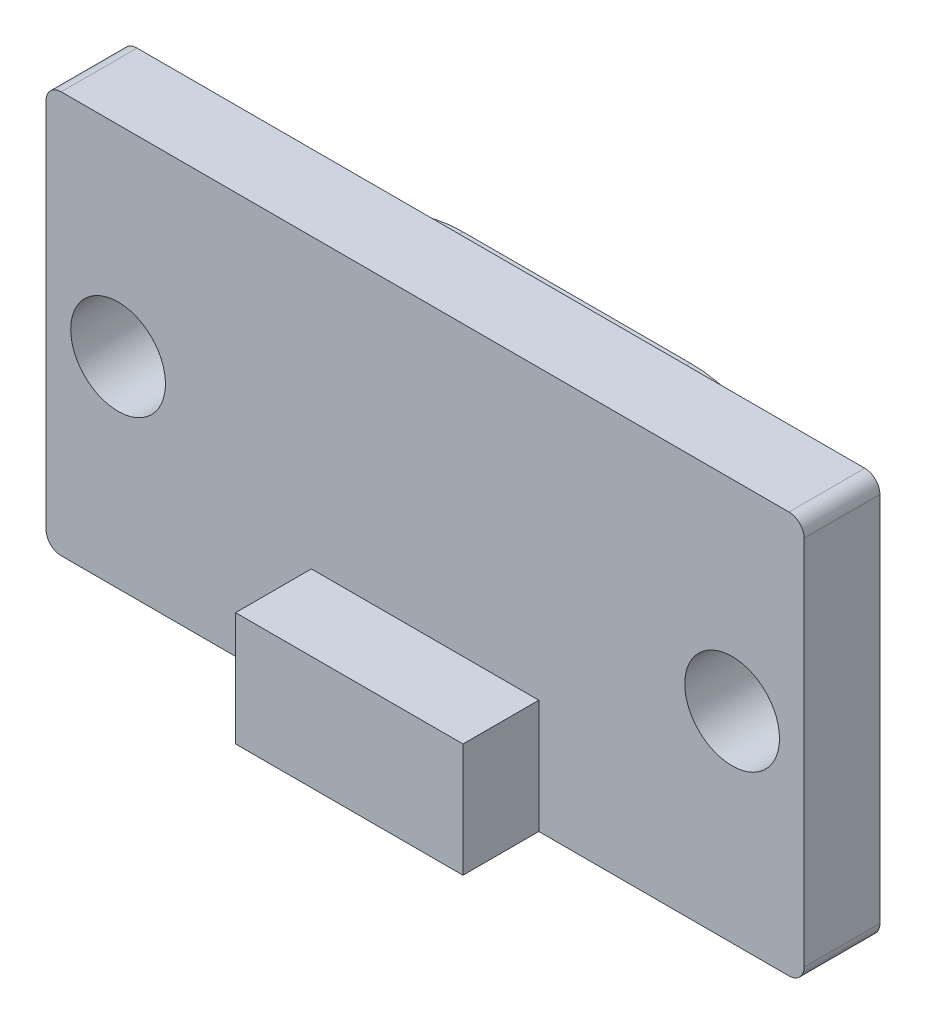
ISO-10303-21;
HEADER;
FILE_DESCRIPTION(('STEP AP214'),'2;1');
FILE_NAME('part.step','',(''),(''),'','','');
FILE_SCHEMA(('AUTOMOTIVE_DESIGN { 1 0 10303 214 1 1 1 1 }'));
ENDSEC;
DATA;
#1=APPLICATION_CONTEXT('core data for automotive mechanical design processes');
#2=APPLICATION_PROTOCOL_DEFINITION('international standard','automotive_design',2000,#1);
#3=PRODUCT_CONTEXT('',#1,'mechanical');
#4=PRODUCT('Part','Part','',(#3));
#5=PRODUCT_RELATED_PRODUCT_CATEGORY('part','',(#4));
#6=PRODUCT_DEFINITION_FORMATION('','',#4);
#7=PRODUCT_DEFINITION_CONTEXT('part definition',#1,'design');
#8=PRODUCT_DEFINITION('design','',#6,#7);
#9=PRODUCT_DEFINITION_SHAPE('','',#8);
#10=(LENGTH_UNIT() NAMED_UNIT(*) SI_UNIT(.MILLI.,.METRE.));
#11=(NAMED_UNIT(*) PLANE_ANGLE_UNIT() SI_UNIT($,.RADIAN.));
#12=(NAMED_UNIT(*) SI_UNIT($,.STERADIAN.) SOLID_ANGLE_UNIT());
#13=UNCERTAINTY_MEASURE_WITH_UNIT(LENGTH_MEASURE(1.E-05),#10,'distance_accuracy_value','');
#14=(GEOMETRIC_REPRESENTATION_CONTEXT(3) GLOBAL_UNCERTAINTY_ASSIGNED_CONTEXT((#13)) GLOBAL_UNIT_ASSIGNED_CONTEXT((#10,
#11,#12)) REPRESENTATION_CONTEXT('',''));
#15=CARTESIAN_POINT('',(0.,0.,0.));
#16=DIRECTION('',(0.,0.,1.));
#17=DIRECTION('',(1.,0.,0.));
#18=AXIS2_PLACEMENT_3D('',#15,#16,#17);
#19=CARTESIAN_POINT('',(0.,0.,2.));
#20=DIRECTION('',(0.,0.,-1.));
#21=DIRECTION('',(-1.,0.,0.));
#22=AXIS2_PLACEMENT_3D('',#19,#20,#21);
#23=PLANE('',#22);
#24=CARTESIAN_POINT('',(-8.1,0.,2.));
#25=DIRECTION('',(0.,0.,1.));
#26=DIRECTION('',(-1.,0.,0.));
#27=AXIS2_PLACEMENT_3D('',#24,#25,#26);
#28=CIRCLE('',#27,1.25);
#29=CARTESIAN_POINT('',(-9.35,0.,2.));
#30=VERTEX_POINT('',#29);
#31=EDGE_CURVE('E212',#30,#30,#28,.T.);
#32=ORIENTED_EDGE('',*,*,#31,.F.);
#33=EDGE_LOOP('',(#32));
#34=FACE_BOUND('',#33,.T.);
#35=CARTESIAN_POINT('',(8.1,0.,2.));
#36=DIRECTION('',(0.,0.,1.));
#37=DIRECTION('',(1.,0.,0.));
#38=AXIS2_PLACEMENT_3D('',#35,#36,#37);
#39=CIRCLE('',#38,1.25);
#40=CARTESIAN_POINT('',(9.35,0.,2.));
#41=VERTEX_POINT('',#40);
#42=EDGE_CURVE('E218',#41,#41,#39,.T.);
#43=ORIENTED_EDGE('',*,*,#42,.F.);
#44=EDGE_LOOP('',(#43));
#45=FACE_BOUND('',#44,.T.);
#46=DIRECTION('',(1.,0.,0.));
#47=VECTOR('',#46,1.);
#48=CARTESIAN_POINT('',(-10.,-5.3,2.));
#49=LINE('',#48,#47);
#50=CARTESIAN_POINT('',(3.,-5.3,2.));
#51=VERTEX_POINT('',#50);
#52=CARTESIAN_POINT('',(9.6,-5.3,2.));
#53=VERTEX_POINT('',#52);
#54=EDGE_CURVE('E232',#51,#53,#49,.T.);
#55=ORIENTED_EDGE('',*,*,#54,.T.);
#56=CARTESIAN_POINT('',(9.6,-4.9,2.));
#57=DIRECTION('',(0.,0.,-1.));
#58=DIRECTION('',(-1.,0.,0.));
#59=AXIS2_PLACEMENT_3D('',#56,#57,#58);
#60=CIRCLE('',#59,0.4);
#61=CARTESIAN_POINT('',(10.,-4.9,2.));
#62=VERTEX_POINT('',#61);
#63=EDGE_CURVE('E267',#53,#62,#60,.F.);
#64=ORIENTED_EDGE('',*,*,#63,.T.);
#65=DIRECTION('',(0.,1.,0.));
#66=VECTOR('',#65,1.);
#67=CARTESIAN_POINT('',(10.,-5.3,2.));
#68=LINE('',#67,#66);
#69=CARTESIAN_POINT('',(10.,4.9,2.));
#70=VERTEX_POINT('',#69);
#71=EDGE_CURVE('E224',#62,#70,#68,.T.);
#72=ORIENTED_EDGE('',*,*,#71,.T.);
#73=CARTESIAN_POINT('',(9.6,4.9,2.));
#74=DIRECTION('',(0.,0.,-1.));
#75=DIRECTION('',(-1.,0.,0.));
#76=AXIS2_PLACEMENT_3D('',#73,#74,#75);
#77=CIRCLE('',#76,0.4);
#78=CARTESIAN_POINT('',(9.6,5.3,2.));
#79=VERTEX_POINT('',#78);
#80=EDGE_CURVE('E262',#70,#79,#77,.F.);
#81=ORIENTED_EDGE('',*,*,#80,.T.);
#82=DIRECTION('',(-1.,0.,0.));
#83=VECTOR('',#82,1.);
#84=CARTESIAN_POINT('',(-10.,5.3,2.));
#85=LINE('',#84,#83);
#86=CARTESIAN_POINT('',(-9.6,5.3,2.));
#87=VERTEX_POINT('',#86);
#88=EDGE_CURVE('E227',#79,#87,#85,.T.);
#89=ORIENTED_EDGE('',*,*,#88,.T.);
#90=CARTESIAN_POINT('',(-9.6,4.9,2.));
#91=DIRECTION('',(0.,0.,-1.));
#92=DIRECTION('',(-1.,0.,0.));
#93=AXIS2_PLACEMENT_3D('',#90,#91,#92);
#94=CIRCLE('',#93,0.4);
#95=CARTESIAN_POINT('',(-10.,4.9,2.));
#96=VERTEX_POINT('',#95);
#97=EDGE_CURVE('E60',#87,#96,#94,.F.);
#98=ORIENTED_EDGE('',*,*,#97,.T.);
#99=DIRECTION('',(0.,-1.,0.));
#100=VECTOR('',#99,1.);
#101=CARTESIAN_POINT('',(-10.,-5.3,2.));
#102=LINE('',#101,#100);
#103=CARTESIAN_POINT('',(-10.,-4.9,2.));
#104=VERTEX_POINT('',#103);
#105=EDGE_CURVE('E230',#96,#104,#102,.T.);
#106=ORIENTED_EDGE('',*,*,#105,.T.);
#107=CARTESIAN_POINT('',(-9.6,-4.9,2.));
#108=DIRECTION('',(0.,0.,-1.));
#109=DIRECTION('',(-1.,0.,0.));
#110=AXIS2_PLACEMENT_3D('',#107,#108,#109);
#111=CIRCLE('',#110,0.4);
#112=CARTESIAN_POINT('',(-9.6,-5.3,2.));
#113=VERTEX_POINT('',#112);
#114=EDGE_CURVE('E265',#104,#113,#111,.F.);
#115=ORIENTED_EDGE('',*,*,#114,.T.);
#116=CARTESIAN_POINT('',(-3.,-5.3,2.));
#117=VERTEX_POINT('',#116);
#118=EDGE_CURVE('E233',#113,#117,#49,.T.);
#119=ORIENTED_EDGE('',*,*,#118,.T.);
#120=DIRECTION('',(0.,-1.,0.));
#121=VECTOR('',#120,1.);
#122=CARTESIAN_POINT('',(-3.,-2.3,2.));
#123=LINE('',#122,#121);
#124=CARTESIAN_POINT('',(-3.,-2.3,2.));
#125=VERTEX_POINT('',#124);
#126=EDGE_CURVE('E173',#125,#117,#123,.T.);
#127=ORIENTED_EDGE('',*,*,#126,.F.);
#128=DIRECTION('',(-1.,0.,0.));
#129=VECTOR('',#128,1.);
#130=CARTESIAN_POINT('',(-3.,-2.3,2.));
#131=LINE('',#130,#129);
#132=CARTESIAN_POINT('',(3.,-2.3,2.));
#133=VERTEX_POINT('',#132);
#134=EDGE_CURVE('E517',#133,#125,#131,.T.);
#135=ORIENTED_EDGE('',*,*,#134,.F.);
#136=DIRECTION('',(0.,1.,0.));
#137=VECTOR('',#136,1.);
#138=CARTESIAN_POINT('',(3.,-2.3,2.));
#139=LINE('',#138,#137);
#140=EDGE_CURVE('E176',#51,#133,#139,.T.);
#141=ORIENTED_EDGE('',*,*,#140,.F.);
#142=EDGE_LOOP('',(#55,#64,#72,#81,#89,#98,#106,#115,#119,#127,#135,#141));
#143=FACE_BOUND('',#142,.T.);
#144=ADVANCED_FACE('F38',(#34,#45,#143),#23,.F.);
#145=CARTESIAN_POINT('',(0.,0.,0.));
#146=DIRECTION('',(0.,0.,-1.));
#147=DIRECTION('',(-1.,0.,0.));
#148=AXIS2_PLACEMENT_3D('',#145,#146,#147);
#149=PLANE('',#148);
#150=CARTESIAN_POINT('',(8.1,0.,0.));
#151=DIRECTION('',(0.,0.,1.));
#152=DIRECTION('',(1.,0.,0.));
#153=AXIS2_PLACEMENT_3D('',#150,#151,#152);
#154=CIRCLE('',#153,1.25);
#155=CARTESIAN_POINT('',(9.35,0.,0.));
#156=VERTEX_POINT('',#155);
#157=EDGE_CURVE('E215',#156,#156,#154,.T.);
#158=ORIENTED_EDGE('',*,*,#157,.T.);
#159=EDGE_LOOP('',(#158));
#160=FACE_BOUND('',#159,.T.);
#161=DIRECTION('',(0.,1.,0.));
#162=VECTOR('',#161,1.);
#163=CARTESIAN_POINT('',(10.,-5.3,0.));
#164=LINE('',#163,#162);
#165=CARTESIAN_POINT('',(10.,-4.9,0.));
#166=VERTEX_POINT('',#165);
#167=CARTESIAN_POINT('',(10.,4.9,0.));
#168=VERTEX_POINT('',#167);
#169=EDGE_CURVE('E221',#166,#168,#164,.T.);
#170=ORIENTED_EDGE('',*,*,#169,.F.);
#171=CARTESIAN_POINT('',(9.6,-4.9,0.));
#172=DIRECTION('',(0.,0.,-1.));
#173=DIRECTION('',(-1.,0.,0.));
#174=AXIS2_PLACEMENT_3D('',#171,#172,#173);
#175=CIRCLE('',#174,0.4);
#176=CARTESIAN_POINT('',(9.6,-5.3,0.));
#177=VERTEX_POINT('',#176);
#178=EDGE_CURVE('E255',#166,#177,#175,.T.);
#179=ORIENTED_EDGE('',*,*,#178,.T.);
#180=DIRECTION('',(1.,0.,0.));
#181=VECTOR('',#180,1.);
#182=CARTESIAN_POINT('',(-10.,-5.3,0.));
#183=LINE('',#182,#181);
#184=CARTESIAN_POINT('',(-9.6,-5.3,0.));
#185=VERTEX_POINT('',#184);
#186=EDGE_CURVE('E228',#185,#177,#183,.T.);
#187=ORIENTED_EDGE('',*,*,#186,.F.);
#188=CARTESIAN_POINT('',(-9.6,-4.9,0.));
#189=DIRECTION('',(0.,0.,-1.));
#190=DIRECTION('',(-1.,0.,0.));
#191=AXIS2_PLACEMENT_3D('',#188,#189,#190);
#192=CIRCLE('',#191,0.4);
#193=CARTESIAN_POINT('',(-10.,-4.9,0.));
#194=VERTEX_POINT('',#193);
#195=EDGE_CURVE('E253',#185,#194,#192,.T.);
#196=ORIENTED_EDGE('',*,*,#195,.T.);
#197=DIRECTION('',(0.,-1.,0.));
#198=VECTOR('',#197,1.);
#199=CARTESIAN_POINT('',(-10.,-5.3,0.));
#200=LINE('',#199,#198);
#201=CARTESIAN_POINT('',(-10.,4.9,0.));
#202=VERTEX_POINT('',#201);
#203=EDGE_CURVE('E241',#202,#194,#200,.T.);
#204=ORIENTED_EDGE('',*,*,#203,.F.);
#205=CARTESIAN_POINT('',(-9.6,4.9,0.));
#206=DIRECTION('',(0.,0.,-1.));
#207=DIRECTION('',(-1.,0.,0.));
#208=AXIS2_PLACEMENT_3D('',#205,#206,#207);
#209=CIRCLE('',#208,0.4);
#210=CARTESIAN_POINT('',(-9.6,5.3,0.));
#211=VERTEX_POINT('',#210);
#212=EDGE_CURVE('E251',#202,#211,#209,.T.);
#213=ORIENTED_EDGE('',*,*,#212,.T.);
#214=DIRECTION('',(-1.,0.,0.));
#215=VECTOR('',#214,1.);
#216=CARTESIAN_POINT('',(-10.,5.3,0.));
#217=LINE('',#216,#215);
#218=CARTESIAN_POINT('',(9.6,5.3,0.));
#219=VERTEX_POINT('',#218);
#220=EDGE_CURVE('E238',#219,#211,#217,.T.);
#221=ORIENTED_EDGE('',*,*,#220,.F.);
#222=CARTESIAN_POINT('',(9.6,4.9,0.));
#223=DIRECTION('',(0.,0.,-1.));
#224=DIRECTION('',(-1.,0.,0.));
#225=AXIS2_PLACEMENT_3D('',#222,#223,#224);
#226=CIRCLE('',#225,0.4);
#227=EDGE_CURVE('E249',#219,#168,#226,.T.);
#228=ORIENTED_EDGE('',*,*,#227,.T.);
#229=EDGE_LOOP('',(#170,#179,#187,#196,#204,#213,#221,#228));
#230=FACE_BOUND('',#229,.T.);
#231=CARTESIAN_POINT('',(-8.1,0.,0.));
#232=DIRECTION('',(0.,0.,1.));
#233=DIRECTION('',(-1.,0.,0.));
#234=AXIS2_PLACEMENT_3D('',#231,#232,#233);
#235=CIRCLE('',#234,1.25);
#236=CARTESIAN_POINT('',(-9.35,0.,0.));
#237=VERTEX_POINT('',#236);
#238=EDGE_CURVE('E211',#237,#237,#235,.T.);
#239=ORIENTED_EDGE('',*,*,#238,.T.);
#240=EDGE_LOOP('',(#239));
#241=FACE_BOUND('',#240,.T.);
#242=DIRECTION('',(-1.,0.,0.));
#243=VECTOR('',#242,1.);
#244=CARTESIAN_POINT('',(3.,-3.4,0.));
#245=LINE('',#244,#243);
#246=CARTESIAN_POINT('',(3.,-3.4,0.));
#247=VERTEX_POINT('',#246);
#248=CARTESIAN_POINT('',(-3.,-3.4,0.));
#249=VERTEX_POINT('',#248);
#250=EDGE_CURVE('E180',#247,#249,#245,.T.);
#251=ORIENTED_EDGE('',*,*,#250,.F.);
#252=CARTESIAN_POINT('',(3.,0.,0.));
#253=DIRECTION('',(0.,0.,-1.));
#254=DIRECTION('',(-1.,0.,0.));
#255=AXIS2_PLACEMENT_3D('',#252,#253,#254);
#256=CIRCLE('',#255,3.4);
#257=CARTESIAN_POINT('',(3.,3.4,0.));
#258=VERTEX_POINT('',#257);
#259=EDGE_CURVE('E177',#258,#247,#256,.T.);
#260=ORIENTED_EDGE('',*,*,#259,.F.);
#261=DIRECTION('',(1.,0.,0.));
#262=VECTOR('',#261,1.);
#263=CARTESIAN_POINT('',(3.,3.4,0.));
#264=LINE('',#263,#262);
#265=CARTESIAN_POINT('',(-3.,3.4,0.));
#266=VERTEX_POINT('',#265);
#267=EDGE_CURVE('E190',#266,#258,#264,.T.);
#268=ORIENTED_EDGE('',*,*,#267,.F.);
#269=CARTESIAN_POINT('',(-3.,0.,0.));
#270=DIRECTION('',(0.,0.,-1.));
#271=DIRECTION('',(-1.,0.,0.));
#272=AXIS2_PLACEMENT_3D('',#269,#270,#271);
#273=CIRCLE('',#272,3.4);
#274=EDGE_CURVE('E198',#249,#266,#273,.T.);
#275=ORIENTED_EDGE('',*,*,#274,.F.);
#276=EDGE_LOOP('',(#251,#260,#268,#275));
#277=FACE_BOUND('',#276,.T.);
#278=ADVANCED_FACE('F283',(#160,#230,#241,#277),#149,.T.);
#279=CARTESIAN_POINT('',(10.,-5.3,2.));
#280=DIRECTION('',(-1.,0.,0.));
#281=DIRECTION('',(0.,0.,1.));
#282=AXIS2_PLACEMENT_3D('',#279,#280,#281);
#283=PLANE('',#282);
#284=ORIENTED_EDGE('',*,*,#71,.F.);
#285=DIRECTION('',(0.,0.,-1.));
#286=VECTOR('',#285,1.);
#287=CARTESIAN_POINT('',(10.,-4.9,2.));
#288=LINE('',#287,#286);
#289=EDGE_CURVE('E246',#62,#166,#288,.T.);
#290=ORIENTED_EDGE('',*,*,#289,.T.);
#291=ORIENTED_EDGE('',*,*,#169,.T.);
#292=DIRECTION('',(0.,0.,-1.));
#293=VECTOR('',#292,1.);
#294=CARTESIAN_POINT('',(10.,4.9,2.));
#295=LINE('',#294,#293);
#296=EDGE_CURVE('E235',#168,#70,#295,.F.);
#297=ORIENTED_EDGE('',*,*,#296,.T.);
#298=EDGE_LOOP('',(#284,#290,#291,#297));
#299=FACE_BOUND('',#298,.T.);
#300=ADVANCED_FACE('F307',(#299),#283,.F.);
#301=CARTESIAN_POINT('',(-10.,5.3,2.));
#302=DIRECTION('',(0.,-1.,0.));
#303=DIRECTION('',(1.,0.,0.));
#304=AXIS2_PLACEMENT_3D('',#301,#302,#303);
#305=PLANE('',#304);
#306=ORIENTED_EDGE('',*,*,#220,.T.);
#307=DIRECTION('',(0.,0.,-1.));
#308=VECTOR('',#307,1.);
#309=CARTESIAN_POINT('',(-9.6,5.3,2.));
#310=LINE('',#309,#308);
#311=EDGE_CURVE('E11',#211,#87,#310,.F.);
#312=ORIENTED_EDGE('',*,*,#311,.T.);
#313=ORIENTED_EDGE('',*,*,#88,.F.);
#314=DIRECTION('',(0.,0.,-1.));
#315=VECTOR('',#314,1.);
#316=CARTESIAN_POINT('',(9.6,5.3,2.));
#317=LINE('',#316,#315);
#318=EDGE_CURVE('E46',#79,#219,#317,.T.);
#319=ORIENTED_EDGE('',*,*,#318,.T.);
#320=EDGE_LOOP('',(#306,#312,#313,#319));
#321=FACE_BOUND('',#320,.T.);
#322=ADVANCED_FACE('F277',(#321),#305,.F.);
#323=CARTESIAN_POINT('',(-10.,-5.3,2.));
#324=DIRECTION('',(1.,0.,0.));
#325=DIRECTION('',(0.,0.,-1.));
#326=AXIS2_PLACEMENT_3D('',#323,#324,#325);
#327=PLANE('',#326);
#328=ORIENTED_EDGE('',*,*,#203,.T.);
#329=DIRECTION('',(0.,0.,-1.));
#330=VECTOR('',#329,1.);
#331=CARTESIAN_POINT('',(-10.,-4.9,2.));
#332=LINE('',#331,#330);
#333=EDGE_CURVE('E53',#194,#104,#332,.F.);
#334=ORIENTED_EDGE('',*,*,#333,.T.);
#335=ORIENTED_EDGE('',*,*,#105,.F.);
#336=DIRECTION('',(0.,0.,-1.));
#337=VECTOR('',#336,1.);
#338=CARTESIAN_POINT('',(-10.,4.9,2.));
#339=LINE('',#338,#337);
#340=EDGE_CURVE('E269',#96,#202,#339,.T.);
#341=ORIENTED_EDGE('',*,*,#340,.T.);
#342=EDGE_LOOP('',(#328,#334,#335,#341));
#343=FACE_BOUND('',#342,.T.);
#344=ADVANCED_FACE('F289',(#343),#327,.F.);
#345=CARTESIAN_POINT('',(-10.,-5.3,2.));
#346=DIRECTION('',(0.,1.,0.));
#347=DIRECTION('',(0.,0.,1.));
#348=AXIS2_PLACEMENT_3D('',#345,#346,#347);
#349=PLANE('',#348);
#350=ORIENTED_EDGE('',*,*,#186,.T.);
#351=DIRECTION('',(0.,0.,-1.));
#352=VECTOR('',#351,1.);
#353=CARTESIAN_POINT('',(9.6,-5.3,2.));
#354=LINE('',#353,#352);
#355=EDGE_CURVE('E260',#177,#53,#354,.F.);
#356=ORIENTED_EDGE('',*,*,#355,.T.);
#357=ORIENTED_EDGE('',*,*,#54,.F.);
#358=DIRECTION('',(0.,0.,-1.));
#359=VECTOR('',#358,1.);
#360=CARTESIAN_POINT('',(3.,-5.3,4.));
#361=LINE('',#360,#359);
#362=CARTESIAN_POINT('',(3.,-5.3,4.));
#363=VERTEX_POINT('',#362);
#364=EDGE_CURVE('E519',#363,#51,#361,.T.);
#365=ORIENTED_EDGE('',*,*,#364,.F.);
#366=DIRECTION('',(1.,0.,0.));
#367=VECTOR('',#366,1.);
#368=CARTESIAN_POINT('',(-3.,-5.3,4.));
#369=LINE('',#368,#367);
#370=CARTESIAN_POINT('',(-3.,-5.3,4.));
#371=VERTEX_POINT('',#370);
#372=EDGE_CURVE('E169',#371,#363,#369,.T.);
#373=ORIENTED_EDGE('',*,*,#372,.F.);
#374=DIRECTION('',(0.,0.,-1.));
#375=VECTOR('',#374,1.);
#376=CARTESIAN_POINT('',(-3.,-5.3,4.));
#377=LINE('',#376,#375);
#378=EDGE_CURVE('E182',#371,#117,#377,.T.);
#379=ORIENTED_EDGE('',*,*,#378,.T.);
#380=ORIENTED_EDGE('',*,*,#118,.F.);
#381=DIRECTION('',(0.,0.,-1.));
#382=VECTOR('',#381,1.);
#383=CARTESIAN_POINT('',(-9.6,-5.3,2.));
#384=LINE('',#383,#382);
#385=EDGE_CURVE('E257',#113,#185,#384,.T.);
#386=ORIENTED_EDGE('',*,*,#385,.T.);
#387=EDGE_LOOP('',(#350,#356,#357,#365,#373,#379,#380,#386));
#388=FACE_BOUND('',#387,.T.);
#389=ADVANCED_FACE('F298',(#388),#349,.F.);
#390=CARTESIAN_POINT('',(8.1,0.,2.));
#391=DIRECTION('',(0.,0.,-1.));
#392=DIRECTION('',(-1.,0.,0.));
#393=AXIS2_PLACEMENT_3D('',#390,#391,#392);
#394=CYLINDRICAL_SURFACE('',#393,1.25);
#395=ORIENTED_EDGE('',*,*,#42,.T.);
#396=EDGE_LOOP('',(#395));
#397=FACE_BOUND('',#396,.T.);
#398=ORIENTED_EDGE('',*,*,#157,.F.);
#399=EDGE_LOOP('',(#398));
#400=FACE_BOUND('',#399,.T.);
#401=ADVANCED_FACE('F324',(#397,#400),#394,.F.);
#402=CARTESIAN_POINT('',(-8.1,0.,2.));
#403=DIRECTION('',(0.,0.,-1.));
#404=DIRECTION('',(-1.,0.,0.));
#405=AXIS2_PLACEMENT_3D('',#402,#403,#404);
#406=CYLINDRICAL_SURFACE('',#405,1.25);
#407=ORIENTED_EDGE('',*,*,#31,.T.);
#408=EDGE_LOOP('',(#407));
#409=FACE_BOUND('',#408,.T.);
#410=ORIENTED_EDGE('',*,*,#238,.F.);
#411=EDGE_LOOP('',(#410));
#412=FACE_BOUND('',#411,.T.);
#413=ADVANCED_FACE('F449',(#409,#412),#406,.F.);
#414=CARTESIAN_POINT('',(3.,0.,-2.));
#415=DIRECTION('',(0.,0.,1.));
#416=DIRECTION('',(1.,0.,0.));
#417=AXIS2_PLACEMENT_3D('',#414,#415,#416);
#418=CYLINDRICAL_SURFACE('',#417,3.4);
#419=ORIENTED_EDGE('',*,*,#259,.T.);
#420=DIRECTION('',(0.,0.,1.));
#421=VECTOR('',#420,1.);
#422=CARTESIAN_POINT('',(3.,-3.4,-2.));
#423=LINE('',#422,#421);
#424=CARTESIAN_POINT('',(3.,-3.4,-2.));
#425=VERTEX_POINT('',#424);
#426=EDGE_CURVE('E209',#425,#247,#423,.T.);
#427=ORIENTED_EDGE('',*,*,#426,.F.);
#428=CARTESIAN_POINT('',(3.,0.,-2.));
#429=DIRECTION('',(0.,0.,-1.));
#430=DIRECTION('',(-1.,0.,0.));
#431=AXIS2_PLACEMENT_3D('',#428,#429,#430);
#432=CIRCLE('',#431,3.4);
#433=CARTESIAN_POINT('',(3.,3.4,-2.));
#434=VERTEX_POINT('',#433);
#435=EDGE_CURVE('E186',#434,#425,#432,.T.);
#436=ORIENTED_EDGE('',*,*,#435,.F.);
#437=DIRECTION('',(0.,0.,1.));
#438=VECTOR('',#437,1.);
#439=CARTESIAN_POINT('',(3.,3.4,-2.));
#440=LINE('',#439,#438);
#441=EDGE_CURVE('E195',#434,#258,#440,.T.);
#442=ORIENTED_EDGE('',*,*,#441,.T.);
#443=EDGE_LOOP('',(#419,#427,#436,#442));
#444=FACE_BOUND('',#443,.T.);
#445=ADVANCED_FACE('F440',(#444),#418,.T.);
#446=CARTESIAN_POINT('',(3.,-3.4,-2.));
#447=DIRECTION('',(0.,1.,0.));
#448=DIRECTION('',(-1.,0.,0.));
#449=AXIS2_PLACEMENT_3D('',#446,#447,#448);
#450=PLANE('',#449);
#451=ORIENTED_EDGE('',*,*,#250,.T.);
#452=DIRECTION('',(0.,0.,1.));
#453=VECTOR('',#452,1.);
#454=CARTESIAN_POINT('',(-3.,-3.4,-2.));
#455=LINE('',#454,#453);
#456=CARTESIAN_POINT('',(-3.,-3.4,-2.));
#457=VERTEX_POINT('',#456);
#458=EDGE_CURVE('E206',#457,#249,#455,.T.);
#459=ORIENTED_EDGE('',*,*,#458,.F.);
#460=DIRECTION('',(-1.,0.,0.));
#461=VECTOR('',#460,1.);
#462=CARTESIAN_POINT('',(3.,-3.4,-2.));
#463=LINE('',#462,#461);
#464=EDGE_CURVE('E189',#425,#457,#463,.T.);
#465=ORIENTED_EDGE('',*,*,#464,.F.);
#466=ORIENTED_EDGE('',*,*,#426,.T.);
#467=EDGE_LOOP('',(#451,#459,#465,#466));
#468=FACE_BOUND('',#467,.T.);
#469=ADVANCED_FACE('F431',(#468),#450,.F.);
#470=CARTESIAN_POINT('',(-3.,0.,-2.));
#471=DIRECTION('',(0.,0.,1.));
#472=DIRECTION('',(1.,0.,0.));
#473=AXIS2_PLACEMENT_3D('',#470,#471,#472);
#474=CYLINDRICAL_SURFACE('',#473,3.4);
#475=ORIENTED_EDGE('',*,*,#274,.T.);
#476=DIRECTION('',(0.,0.,1.));
#477=VECTOR('',#476,1.);
#478=CARTESIAN_POINT('',(-3.,3.4,-2.));
#479=LINE('',#478,#477);
#480=CARTESIAN_POINT('',(-3.,3.4,-2.));
#481=VERTEX_POINT('',#480);
#482=EDGE_CURVE('E204',#481,#266,#479,.T.);
#483=ORIENTED_EDGE('',*,*,#482,.F.);
#484=CARTESIAN_POINT('',(-3.,0.,-2.));
#485=DIRECTION('',(0.,0.,-1.));
#486=DIRECTION('',(-1.,0.,0.));
#487=AXIS2_PLACEMENT_3D('',#484,#485,#486);
#488=CIRCLE('',#487,3.4);
#489=EDGE_CURVE('E192',#457,#481,#488,.T.);
#490=ORIENTED_EDGE('',*,*,#489,.F.);
#491=ORIENTED_EDGE('',*,*,#458,.T.);
#492=EDGE_LOOP('',(#475,#483,#490,#491));
#493=FACE_BOUND('',#492,.T.);
#494=ADVANCED_FACE('F422',(#493),#474,.T.);
#495=CARTESIAN_POINT('',(3.,3.4,-2.));
#496=DIRECTION('',(0.,-1.,0.));
#497=DIRECTION('',(1.,0.,0.));
#498=AXIS2_PLACEMENT_3D('',#495,#496,#497);
#499=PLANE('',#498);
#500=ORIENTED_EDGE('',*,*,#267,.T.);
#501=ORIENTED_EDGE('',*,*,#441,.F.);
#502=DIRECTION('',(1.,0.,0.));
#503=VECTOR('',#502,1.);
#504=CARTESIAN_POINT('',(3.,3.4,-2.));
#505=LINE('',#504,#503);
#506=EDGE_CURVE('E194',#481,#434,#505,.T.);
#507=ORIENTED_EDGE('',*,*,#506,.F.);
#508=ORIENTED_EDGE('',*,*,#482,.T.);
#509=EDGE_LOOP('',(#500,#501,#507,#508));
#510=FACE_BOUND('',#509,.T.);
#511=ADVANCED_FACE('F413',(#510),#499,.F.);
#512=CARTESIAN_POINT('',(3.,0.,-2.));
#513=DIRECTION('',(0.,0.,-1.));
#514=DIRECTION('',(-1.,0.,0.));
#515=AXIS2_PLACEMENT_3D('',#512,#513,#514);
#516=PLANE('',#515);
#517=ORIENTED_EDGE('',*,*,#435,.T.);
#518=ORIENTED_EDGE('',*,*,#464,.T.);
#519=ORIENTED_EDGE('',*,*,#489,.T.);
#520=ORIENTED_EDGE('',*,*,#506,.T.);
#521=EDGE_LOOP('',(#517,#518,#519,#520));
#522=FACE_BOUND('',#521,.T.);
#523=ADVANCED_FACE('F390',(#522),#516,.T.);
#524=CARTESIAN_POINT('',(3.,-2.3,4.));
#525=DIRECTION('',(-1.,0.,0.));
#526=DIRECTION('',(0.,-1.,0.));
#527=AXIS2_PLACEMENT_3D('',#524,#525,#526);
#528=PLANE('',#527);
#529=ORIENTED_EDGE('',*,*,#140,.T.);
#530=DIRECTION('',(0.,0.,-1.));
#531=VECTOR('',#530,1.);
#532=CARTESIAN_POINT('',(3.,-2.3,4.));
#533=LINE('',#532,#531);
#534=CARTESIAN_POINT('',(3.,-2.3,4.));
#535=VERTEX_POINT('',#534);
#536=EDGE_CURVE('E157',#535,#133,#533,.T.);
#537=ORIENTED_EDGE('',*,*,#536,.F.);
#538=DIRECTION('',(0.,1.,0.));
#539=VECTOR('',#538,1.);
#540=CARTESIAN_POINT('',(3.,-2.3,4.));
#541=LINE('',#540,#539);
#542=EDGE_CURVE('E164',#363,#535,#541,.T.);
#543=ORIENTED_EDGE('',*,*,#542,.F.);
#544=ORIENTED_EDGE('',*,*,#364,.T.);
#545=EDGE_LOOP('',(#529,#537,#543,#544));
#546=FACE_BOUND('',#545,.T.);
#547=ADVANCED_FACE('F175',(#546),#528,.F.);
#548=CARTESIAN_POINT('',(-3.,-2.3,4.));
#549=DIRECTION('',(0.,-1.,0.));
#550=DIRECTION('',(0.,0.,-1.));
#551=AXIS2_PLACEMENT_3D('',#548,#549,#550);
#552=PLANE('',#551);
#553=ORIENTED_EDGE('',*,*,#134,.T.);
#554=DIRECTION('',(0.,0.,-1.));
#555=VECTOR('',#554,1.);
#556=CARTESIAN_POINT('',(-3.,-2.3,4.));
#557=LINE('',#556,#555);
#558=CARTESIAN_POINT('',(-3.,-2.3,4.));
#559=VERTEX_POINT('',#558);
#560=EDGE_CURVE('E160',#559,#125,#557,.T.);
#561=ORIENTED_EDGE('',*,*,#560,.F.);
#562=DIRECTION('',(-1.,0.,0.));
#563=VECTOR('',#562,1.);
#564=CARTESIAN_POINT('',(-3.,-2.3,4.));
#565=LINE('',#564,#563);
#566=EDGE_CURVE('E152',#535,#559,#565,.T.);
#567=ORIENTED_EDGE('',*,*,#566,.F.);
#568=ORIENTED_EDGE('',*,*,#536,.T.);
#569=EDGE_LOOP('',(#553,#561,#567,#568));
#570=FACE_BOUND('',#569,.T.);
#571=ADVANCED_FACE('F155',(#570),#552,.F.);
#572=CARTESIAN_POINT('',(-3.,-2.3,4.));
#573=DIRECTION('',(1.,0.,0.));
#574=DIRECTION('',(0.,1.,0.));
#575=AXIS2_PLACEMENT_3D('',#572,#573,#574);
#576=PLANE('',#575);
#577=ORIENTED_EDGE('',*,*,#126,.T.);
#578=ORIENTED_EDGE('',*,*,#378,.F.);
#579=DIRECTION('',(0.,-1.,0.));
#580=VECTOR('',#579,1.);
#581=CARTESIAN_POINT('',(-3.,-2.3,4.));
#582=LINE('',#581,#580);
#583=EDGE_CURVE('E163',#559,#371,#582,.T.);
#584=ORIENTED_EDGE('',*,*,#583,.F.);
#585=ORIENTED_EDGE('',*,*,#560,.T.);
#586=EDGE_LOOP('',(#577,#578,#584,#585));
#587=FACE_BOUND('',#586,.T.);
#588=ADVANCED_FACE('F367',(#587),#576,.F.);
#589=CARTESIAN_POINT('',(0.,0.,4.));
#590=DIRECTION('',(0.,0.,1.));
#591=DIRECTION('',(1.,0.,0.));
#592=AXIS2_PLACEMENT_3D('',#589,#590,#591);
#593=PLANE('',#592);
#594=ORIENTED_EDGE('',*,*,#542,.T.);
#595=ORIENTED_EDGE('',*,*,#566,.T.);
#596=ORIENTED_EDGE('',*,*,#583,.T.);
#597=ORIENTED_EDGE('',*,*,#372,.T.);
#598=EDGE_LOOP('',(#594,#595,#596,#597));
#599=FACE_BOUND('',#598,.T.);
#600=ADVANCED_FACE('F167',(#599),#593,.T.);
#601=CARTESIAN_POINT('',(9.6,-4.9,2.));
#602=DIRECTION('',(0.,0.,-1.));
#603=DIRECTION('',(-1.,0.,0.));
#604=AXIS2_PLACEMENT_3D('',#601,#602,#603);
#605=CYLINDRICAL_SURFACE('',#604,0.4);
#606=ORIENTED_EDGE('',*,*,#63,.F.);
#607=ORIENTED_EDGE('',*,*,#355,.F.);
#608=ORIENTED_EDGE('',*,*,#178,.F.);
#609=ORIENTED_EDGE('',*,*,#289,.F.);
#610=EDGE_LOOP('',(#606,#607,#608,#609));
#611=FACE_BOUND('',#610,.T.);
#612=ADVANCED_FACE('F304',(#611),#605,.T.);
#613=CARTESIAN_POINT('',(-9.6,-4.9,2.));
#614=DIRECTION('',(0.,0.,-1.));
#615=DIRECTION('',(-1.,0.,0.));
#616=AXIS2_PLACEMENT_3D('',#613,#614,#615);
#617=CYLINDRICAL_SURFACE('',#616,0.4);
#618=ORIENTED_EDGE('',*,*,#114,.F.);
#619=ORIENTED_EDGE('',*,*,#333,.F.);
#620=ORIENTED_EDGE('',*,*,#195,.F.);
#621=ORIENTED_EDGE('',*,*,#385,.F.);
#622=EDGE_LOOP('',(#618,#619,#620,#621));
#623=FACE_BOUND('',#622,.T.);
#624=ADVANCED_FACE('F295',(#623),#617,.T.);
#625=CARTESIAN_POINT('',(-9.6,4.9,2.));
#626=DIRECTION('',(0.,0.,-1.));
#627=DIRECTION('',(-1.,0.,0.));
#628=AXIS2_PLACEMENT_3D('',#625,#626,#627);
#629=CYLINDRICAL_SURFACE('',#628,0.4);
#630=ORIENTED_EDGE('',*,*,#97,.F.);
#631=ORIENTED_EDGE('',*,*,#311,.F.);
#632=ORIENTED_EDGE('',*,*,#212,.F.);
#633=ORIENTED_EDGE('',*,*,#340,.F.);
#634=EDGE_LOOP('',(#630,#631,#632,#633));
#635=FACE_BOUND('',#634,.T.);
#636=ADVANCED_FACE('F288',(#635),#629,.T.);
#637=CARTESIAN_POINT('',(9.6,4.9,2.));
#638=DIRECTION('',(0.,0.,-1.));
#639=DIRECTION('',(-1.,0.,0.));
#640=AXIS2_PLACEMENT_3D('',#637,#638,#639);
#641=CYLINDRICAL_SURFACE('',#640,0.4);
#642=ORIENTED_EDGE('',*,*,#80,.F.);
#643=ORIENTED_EDGE('',*,*,#296,.F.);
#644=ORIENTED_EDGE('',*,*,#227,.F.);
#645=ORIENTED_EDGE('',*,*,#318,.F.);
#646=EDGE_LOOP('',(#642,#643,#644,#645));
#647=FACE_BOUND('',#646,.T.);
#648=ADVANCED_FACE('F40',(#647),#641,.T.);
#649=CLOSED_SHELL('',(#144,#278,#300,#322,#344,#389,#401,#413,#445,#469,#494,#511,#523,#547,
#571,#588,#600,#612,#624,#636,#648));
#650=MANIFOLD_SOLID_BREP('B2',#649);
#651=ADVANCED_BREP_SHAPE_REPRESENTATION('',(#18,#650),#14);
#652=SHAPE_DEFINITION_REPRESENTATION(#9,#651);
ENDSEC;
END-ISO-10303-21;
